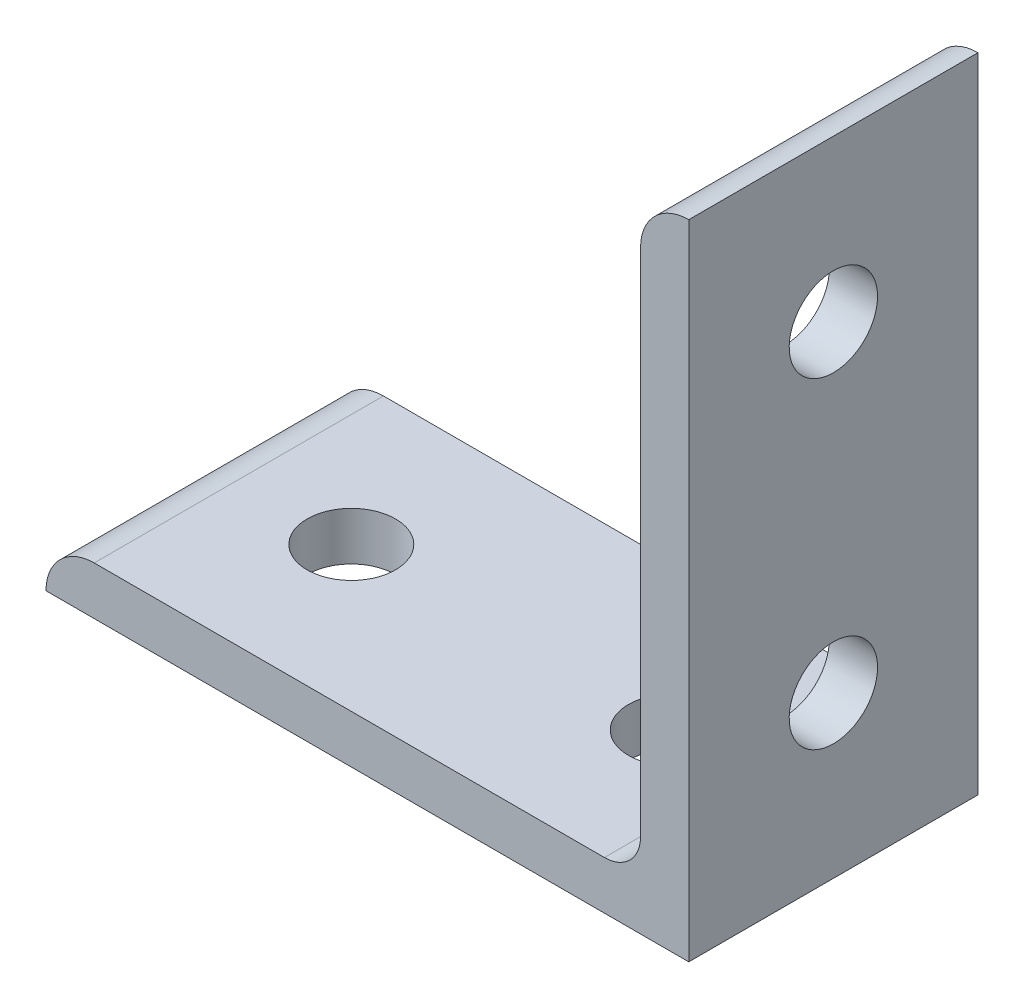
ISO-10303-21;
HEADER;
FILE_DESCRIPTION(('STEP AP214'),'2;1');
FILE_NAME('part.step','',(''),(''),'','','');
FILE_SCHEMA(('AUTOMOTIVE_DESIGN { 1 0 10303 214 1 1 1 1 }'));
ENDSEC;
DATA;
#1=APPLICATION_CONTEXT('core data for automotive mechanical design processes');
#2=APPLICATION_PROTOCOL_DEFINITION('international standard','automotive_design',2000,#1);
#3=PRODUCT_CONTEXT('',#1,'mechanical');
#4=PRODUCT('Part','Part','',(#3));
#5=PRODUCT_RELATED_PRODUCT_CATEGORY('part','',(#4));
#6=PRODUCT_DEFINITION_FORMATION('','',#4);
#7=PRODUCT_DEFINITION_CONTEXT('part definition',#1,'design');
#8=PRODUCT_DEFINITION('design','',#6,#7);
#9=PRODUCT_DEFINITION_SHAPE('','',#8);
#10=(LENGTH_UNIT() NAMED_UNIT(*) SI_UNIT(.MILLI.,.METRE.));
#11=(NAMED_UNIT(*) PLANE_ANGLE_UNIT() SI_UNIT($,.RADIAN.));
#12=(NAMED_UNIT(*) SI_UNIT($,.STERADIAN.) SOLID_ANGLE_UNIT());
#13=UNCERTAINTY_MEASURE_WITH_UNIT(LENGTH_MEASURE(1.E-05),#10,'distance_accuracy_value','');
#14=(GEOMETRIC_REPRESENTATION_CONTEXT(3) GLOBAL_UNCERTAINTY_ASSIGNED_CONTEXT((#13)) GLOBAL_UNIT_ASSIGNED_CONTEXT((#10,
#11,#12)) REPRESENTATION_CONTEXT('',''));
#15=CARTESIAN_POINT('',(0.,0.,0.));
#16=DIRECTION('',(0.,0.,1.));
#17=DIRECTION('',(1.,0.,0.));
#18=AXIS2_PLACEMENT_3D('',#15,#16,#17);
#19=CARTESIAN_POINT('',(0.,0.,-9.));
#20=DIRECTION('',(0.,-1.,0.));
#21=DIRECTION('',(1.,0.,0.));
#22=AXIS2_PLACEMENT_3D('',#19,#20,#21);
#23=PLANE('',#22);
#24=CARTESIAN_POINT('',(-30.,0.,0.));
#25=DIRECTION('',(0.,1.,0.));
#26=DIRECTION('',(-1.,0.,0.));
#27=AXIS2_PLACEMENT_3D('',#24,#25,#26);
#28=CIRCLE('',#27,2.75);
#29=CARTESIAN_POINT('',(-32.75,0.,0.));
#30=VERTEX_POINT('',#29);
#31=EDGE_CURVE('E193',#30,#30,#28,.T.);
#32=ORIENTED_EDGE('',*,*,#31,.T.);
#33=EDGE_LOOP('',(#32));
#34=FACE_BOUND('',#33,.T.);
#35=CARTESIAN_POINT('',(-10.,0.,0.));
#36=DIRECTION('',(0.,1.,0.));
#37=DIRECTION('',(-1.,0.,0.));
#38=AXIS2_PLACEMENT_3D('',#35,#36,#37);
#39=CIRCLE('',#38,2.75);
#40=CARTESIAN_POINT('',(-12.75,0.,0.));
#41=VERTEX_POINT('',#40);
#42=EDGE_CURVE('E130',#41,#41,#39,.T.);
#43=ORIENTED_EDGE('',*,*,#42,.T.);
#44=EDGE_LOOP('',(#43));
#45=FACE_BOUND('',#44,.T.);
#46=DIRECTION('',(1.,0.,0.));
#47=VECTOR('',#46,1.);
#48=CARTESIAN_POINT('',(0.,0.,9.));
#49=LINE('',#48,#47);
#50=CARTESIAN_POINT('',(-40.,0.,9.));
#51=VERTEX_POINT('',#50);
#52=CARTESIAN_POINT('',(0.,0.,9.));
#53=VERTEX_POINT('',#52);
#54=EDGE_CURVE('E126',#51,#53,#49,.T.);
#55=ORIENTED_EDGE('',*,*,#54,.F.);
#56=DIRECTION('',(0.,0.,1.));
#57=VECTOR('',#56,1.);
#58=CARTESIAN_POINT('',(-40.,0.,-9.));
#59=LINE('',#58,#57);
#60=CARTESIAN_POINT('',(-40.,0.,-9.));
#61=VERTEX_POINT('',#60);
#62=EDGE_CURVE('E11',#61,#51,#59,.T.);
#63=ORIENTED_EDGE('',*,*,#62,.F.);
#64=DIRECTION('',(1.,0.,0.));
#65=VECTOR('',#64,1.);
#66=CARTESIAN_POINT('',(0.,0.,-9.));
#67=LINE('',#66,#65);
#68=CARTESIAN_POINT('',(0.,0.,-9.));
#69=VERTEX_POINT('',#68);
#70=EDGE_CURVE('E144',#61,#69,#67,.T.);
#71=ORIENTED_EDGE('',*,*,#70,.T.);
#72=DIRECTION('',(0.,0.,1.));
#73=VECTOR('',#72,1.);
#74=CARTESIAN_POINT('',(0.,0.,-9.));
#75=LINE('',#74,#73);
#76=EDGE_CURVE('E38',#69,#53,#75,.T.);
#77=ORIENTED_EDGE('',*,*,#76,.T.);
#78=EDGE_LOOP('',(#55,#63,#71,#77));
#79=FACE_BOUND('',#78,.T.);
#80=ADVANCED_FACE('F35',(#34,#45,#79),#23,.T.);
#81=CARTESIAN_POINT('',(-37.,0.,-9.));
#82=DIRECTION('',(0.,0.,1.));
#83=DIRECTION('',(1.,0.,0.));
#84=AXIS2_PLACEMENT_3D('',#81,#82,#83);
#85=CYLINDRICAL_SURFACE('',#84,2.99999999999999);
#86=CARTESIAN_POINT('',(-37.,0.,9.));
#87=DIRECTION('',(0.,0.,1.));
#88=DIRECTION('',(-1.,0.,0.));
#89=AXIS2_PLACEMENT_3D('',#86,#87,#88);
#90=CIRCLE('',#89,2.99999999999999);
#91=CARTESIAN_POINT('',(-37.,3.,9.));
#92=VERTEX_POINT('',#91);
#93=EDGE_CURVE('E142',#92,#51,#90,.T.);
#94=ORIENTED_EDGE('',*,*,#93,.F.);
#95=DIRECTION('',(0.,0.,1.));
#96=VECTOR('',#95,1.);
#97=CARTESIAN_POINT('',(-37.,3.,-9.));
#98=LINE('',#97,#96);
#99=CARTESIAN_POINT('',(-37.,3.,-9.));
#100=VERTEX_POINT('',#99);
#101=EDGE_CURVE('E44',#100,#92,#98,.T.);
#102=ORIENTED_EDGE('',*,*,#101,.F.);
#103=CARTESIAN_POINT('',(-37.,0.,-9.));
#104=DIRECTION('',(0.,0.,1.));
#105=DIRECTION('',(-1.,0.,0.));
#106=AXIS2_PLACEMENT_3D('',#103,#104,#105);
#107=CIRCLE('',#106,2.99999999999999);
#108=EDGE_CURVE('E116',#100,#61,#107,.T.);
#109=ORIENTED_EDGE('',*,*,#108,.T.);
#110=ORIENTED_EDGE('',*,*,#62,.T.);
#111=EDGE_LOOP('',(#94,#102,#109,#110));
#112=FACE_BOUND('',#111,.T.);
#113=ADVANCED_FACE('F154',(#112),#85,.T.);
#114=CARTESIAN_POINT('',(-37.,3.,-9.));
#115=DIRECTION('',(0.,1.,0.));
#116=DIRECTION('',(-1.,0.,0.));
#117=AXIS2_PLACEMENT_3D('',#114,#115,#116);
#118=PLANE('',#117);
#119=CARTESIAN_POINT('',(-30.,3.,0.));
#120=DIRECTION('',(0.,1.,0.));
#121=DIRECTION('',(-1.,0.,0.));
#122=AXIS2_PLACEMENT_3D('',#119,#120,#121);
#123=CIRCLE('',#122,2.75);
#124=CARTESIAN_POINT('',(-32.75,3.,0.));
#125=VERTEX_POINT('',#124);
#126=EDGE_CURVE('E189',#125,#125,#123,.T.);
#127=ORIENTED_EDGE('',*,*,#126,.F.);
#128=EDGE_LOOP('',(#127));
#129=FACE_BOUND('',#128,.T.);
#130=CARTESIAN_POINT('',(-10.,3.,0.));
#131=DIRECTION('',(0.,1.,0.));
#132=DIRECTION('',(-1.,0.,0.));
#133=AXIS2_PLACEMENT_3D('',#130,#131,#132);
#134=CIRCLE('',#133,2.75);
#135=CARTESIAN_POINT('',(-12.75,3.,0.));
#136=VERTEX_POINT('',#135);
#137=EDGE_CURVE('E202',#136,#136,#134,.T.);
#138=ORIENTED_EDGE('',*,*,#137,.F.);
#139=EDGE_LOOP('',(#138));
#140=FACE_BOUND('',#139,.T.);
#141=DIRECTION('',(-1.,0.,0.));
#142=VECTOR('',#141,1.);
#143=CARTESIAN_POINT('',(-37.,3.,9.));
#144=LINE('',#143,#142);
#145=CARTESIAN_POINT('',(-5.25,3.,9.));
#146=VERTEX_POINT('',#145);
#147=EDGE_CURVE('E103',#146,#92,#144,.T.);
#148=ORIENTED_EDGE('',*,*,#147,.F.);
#149=DIRECTION('',(0.,0.,1.));
#150=VECTOR('',#149,1.);
#151=CARTESIAN_POINT('',(-5.25,3.,-9.));
#152=LINE('',#151,#150);
#153=CARTESIAN_POINT('',(-5.25,3.,-9.));
#154=VERTEX_POINT('',#153);
#155=EDGE_CURVE('E98',#154,#146,#152,.T.);
#156=ORIENTED_EDGE('',*,*,#155,.F.);
#157=DIRECTION('',(-1.,0.,0.));
#158=VECTOR('',#157,1.);
#159=CARTESIAN_POINT('',(-37.,3.,-9.));
#160=LINE('',#159,#158);
#161=EDGE_CURVE('E101',#154,#100,#160,.T.);
#162=ORIENTED_EDGE('',*,*,#161,.T.);
#163=ORIENTED_EDGE('',*,*,#101,.T.);
#164=EDGE_LOOP('',(#148,#156,#162,#163));
#165=FACE_BOUND('',#164,.T.);
#166=ADVANCED_FACE('F100',(#129,#140,#165),#118,.T.);
#167=CARTESIAN_POINT('',(-5.25,5.25,-9.));
#168=DIRECTION('',(0.,0.,1.));
#169=DIRECTION('',(1.,0.,0.));
#170=AXIS2_PLACEMENT_3D('',#167,#168,#169);
#171=CYLINDRICAL_SURFACE('',#170,2.25);
#172=CARTESIAN_POINT('',(-5.25,5.25,9.));
#173=DIRECTION('',(0.,0.,-1.));
#174=DIRECTION('',(1.,0.,0.));
#175=AXIS2_PLACEMENT_3D('',#172,#173,#174);
#176=CIRCLE('',#175,2.25);
#177=CARTESIAN_POINT('',(-3.,5.25,9.));
#178=VERTEX_POINT('',#177);
#179=EDGE_CURVE('E139',#178,#146,#176,.T.);
#180=ORIENTED_EDGE('',*,*,#179,.F.);
#181=DIRECTION('',(0.,0.,1.));
#182=VECTOR('',#181,1.);
#183=CARTESIAN_POINT('',(-3.,5.25,-9.));
#184=LINE('',#183,#182);
#185=CARTESIAN_POINT('',(-3.,5.25,-9.));
#186=VERTEX_POINT('',#185);
#187=EDGE_CURVE('E108',#186,#178,#184,.T.);
#188=ORIENTED_EDGE('',*,*,#187,.F.);
#189=CARTESIAN_POINT('',(-5.25,5.25,-9.));
#190=DIRECTION('',(0.,0.,-1.));
#191=DIRECTION('',(1.,0.,0.));
#192=AXIS2_PLACEMENT_3D('',#189,#190,#191);
#193=CIRCLE('',#192,2.25);
#194=EDGE_CURVE('E114',#186,#154,#193,.T.);
#195=ORIENTED_EDGE('',*,*,#194,.T.);
#196=ORIENTED_EDGE('',*,*,#155,.T.);
#197=EDGE_LOOP('',(#180,#188,#195,#196));
#198=FACE_BOUND('',#197,.T.);
#199=ADVANCED_FACE('F118',(#198),#171,.F.);
#200=CARTESIAN_POINT('',(-3.,5.25,-9.));
#201=DIRECTION('',(-1.,0.,0.));
#202=DIRECTION('',(0.,-1.,0.));
#203=AXIS2_PLACEMENT_3D('',#200,#201,#202);
#204=PLANE('',#203);
#205=CARTESIAN_POINT('',(-3.,10.,0.));
#206=DIRECTION('',(-1.,0.,0.));
#207=DIRECTION('',(0.,-1.,0.));
#208=AXIS2_PLACEMENT_3D('',#205,#206,#207);
#209=CIRCLE('',#208,2.75);
#210=CARTESIAN_POINT('',(-3.,7.25,0.));
#211=VERTEX_POINT('',#210);
#212=EDGE_CURVE('E198',#211,#211,#209,.T.);
#213=ORIENTED_EDGE('',*,*,#212,.F.);
#214=EDGE_LOOP('',(#213));
#215=FACE_BOUND('',#214,.T.);
#216=CARTESIAN_POINT('',(-3.,30.,0.));
#217=DIRECTION('',(-1.,0.,0.));
#218=DIRECTION('',(0.,-1.,0.));
#219=AXIS2_PLACEMENT_3D('',#216,#217,#218);
#220=CIRCLE('',#219,2.75);
#221=CARTESIAN_POINT('',(-3.,27.25,0.));
#222=VERTEX_POINT('',#221);
#223=EDGE_CURVE('E190',#222,#222,#220,.T.);
#224=ORIENTED_EDGE('',*,*,#223,.F.);
#225=EDGE_LOOP('',(#224));
#226=FACE_BOUND('',#225,.T.);
#227=DIRECTION('',(0.,-1.,0.));
#228=VECTOR('',#227,1.);
#229=CARTESIAN_POINT('',(-3.,5.25,9.));
#230=LINE('',#229,#228);
#231=CARTESIAN_POINT('',(-2.99999999999999,37.,9.));
#232=VERTEX_POINT('',#231);
#233=EDGE_CURVE('E136',#232,#178,#230,.T.);
#234=ORIENTED_EDGE('',*,*,#233,.F.);
#235=DIRECTION('',(0.,0.,1.));
#236=VECTOR('',#235,1.);
#237=CARTESIAN_POINT('',(-2.99999999999999,37.,-9.));
#238=LINE('',#237,#236);
#239=CARTESIAN_POINT('',(-2.99999999999999,37.,-9.));
#240=VERTEX_POINT('',#239);
#241=EDGE_CURVE('E148',#240,#232,#238,.T.);
#242=ORIENTED_EDGE('',*,*,#241,.F.);
#243=DIRECTION('',(0.,-1.,0.));
#244=VECTOR('',#243,1.);
#245=CARTESIAN_POINT('',(-3.,5.25,-9.));
#246=LINE('',#245,#244);
#247=EDGE_CURVE('E119',#240,#186,#246,.T.);
#248=ORIENTED_EDGE('',*,*,#247,.T.);
#249=ORIENTED_EDGE('',*,*,#187,.T.);
#250=EDGE_LOOP('',(#234,#242,#248,#249));
#251=FACE_BOUND('',#250,.T.);
#252=ADVANCED_FACE('F169',(#215,#226,#251),#204,.T.);
#253=CARTESIAN_POINT('',(0.,37.,-9.));
#254=DIRECTION('',(0.,0.,1.));
#255=DIRECTION('',(1.,0.,0.));
#256=AXIS2_PLACEMENT_3D('',#253,#254,#255);
#257=CYLINDRICAL_SURFACE('',#256,2.99999999999999);
#258=CARTESIAN_POINT('',(0.,37.,9.));
#259=DIRECTION('',(0.,0.,1.));
#260=DIRECTION('',(-1.,0.,0.));
#261=AXIS2_PLACEMENT_3D('',#258,#259,#260);
#262=CIRCLE('',#261,2.99999999999999);
#263=CARTESIAN_POINT('',(0.,40.,9.));
#264=VERTEX_POINT('',#263);
#265=EDGE_CURVE('E133',#264,#232,#262,.T.);
#266=ORIENTED_EDGE('',*,*,#265,.F.);
#267=DIRECTION('',(0.,0.,1.));
#268=VECTOR('',#267,1.);
#269=CARTESIAN_POINT('',(0.,40.,-9.));
#270=LINE('',#269,#268);
#271=CARTESIAN_POINT('',(0.,40.,-9.));
#272=VERTEX_POINT('',#271);
#273=EDGE_CURVE('E149',#272,#264,#270,.T.);
#274=ORIENTED_EDGE('',*,*,#273,.F.);
#275=CARTESIAN_POINT('',(0.,37.,-9.));
#276=DIRECTION('',(0.,0.,1.));
#277=DIRECTION('',(-1.,0.,0.));
#278=AXIS2_PLACEMENT_3D('',#275,#276,#277);
#279=CIRCLE('',#278,2.99999999999999);
#280=EDGE_CURVE('E121',#272,#240,#279,.T.);
#281=ORIENTED_EDGE('',*,*,#280,.T.);
#282=ORIENTED_EDGE('',*,*,#241,.T.);
#283=EDGE_LOOP('',(#266,#274,#281,#282));
#284=FACE_BOUND('',#283,.T.);
#285=ADVANCED_FACE('F172',(#284),#257,.T.);
#286=CARTESIAN_POINT('',(0.,0.,-9.));
#287=DIRECTION('',(1.,0.,0.));
#288=DIRECTION('',(0.,0.,-1.));
#289=AXIS2_PLACEMENT_3D('',#286,#287,#288);
#290=PLANE('',#289);
#291=CARTESIAN_POINT('',(0.,10.,0.));
#292=DIRECTION('',(-1.,0.,0.));
#293=DIRECTION('',(0.,-1.,0.));
#294=AXIS2_PLACEMENT_3D('',#291,#292,#293);
#295=CIRCLE('',#294,2.75);
#296=CARTESIAN_POINT('',(0.,7.25,0.));
#297=VERTEX_POINT('',#296);
#298=EDGE_CURVE('E184',#297,#297,#295,.T.);
#299=ORIENTED_EDGE('',*,*,#298,.T.);
#300=EDGE_LOOP('',(#299));
#301=FACE_BOUND('',#300,.T.);
#302=CARTESIAN_POINT('',(0.,30.,0.));
#303=DIRECTION('',(-1.,0.,0.));
#304=DIRECTION('',(0.,-1.,0.));
#305=AXIS2_PLACEMENT_3D('',#302,#303,#304);
#306=CIRCLE('',#305,2.75);
#307=CARTESIAN_POINT('',(0.,27.25,0.));
#308=VERTEX_POINT('',#307);
#309=EDGE_CURVE('E187',#308,#308,#306,.T.);
#310=ORIENTED_EDGE('',*,*,#309,.T.);
#311=EDGE_LOOP('',(#310));
#312=FACE_BOUND('',#311,.T.);
#313=DIRECTION('',(0.,1.,0.));
#314=VECTOR('',#313,1.);
#315=CARTESIAN_POINT('',(0.,0.,9.));
#316=LINE('',#315,#314);
#317=EDGE_CURVE('E129',#53,#264,#316,.T.);
#318=ORIENTED_EDGE('',*,*,#317,.F.);
#319=ORIENTED_EDGE('',*,*,#76,.F.);
#320=DIRECTION('',(0.,1.,0.));
#321=VECTOR('',#320,1.);
#322=CARTESIAN_POINT('',(0.,0.,-9.));
#323=LINE('',#322,#321);
#324=EDGE_CURVE('E209',#69,#272,#323,.T.);
#325=ORIENTED_EDGE('',*,*,#324,.T.);
#326=ORIENTED_EDGE('',*,*,#273,.T.);
#327=EDGE_LOOP('',(#318,#319,#325,#326));
#328=FACE_BOUND('',#327,.T.);
#329=ADVANCED_FACE('F151',(#301,#312,#328),#290,.T.);
#330=CARTESIAN_POINT('',(-37.,0.,-9.));
#331=DIRECTION('',(0.,0.,-1.));
#332=DIRECTION('',(-1.,0.,0.));
#333=AXIS2_PLACEMENT_3D('',#330,#331,#332);
#334=PLANE('',#333);
#335=ORIENTED_EDGE('',*,*,#70,.F.);
#336=ORIENTED_EDGE('',*,*,#108,.F.);
#337=ORIENTED_EDGE('',*,*,#161,.F.);
#338=ORIENTED_EDGE('',*,*,#194,.F.);
#339=ORIENTED_EDGE('',*,*,#247,.F.);
#340=ORIENTED_EDGE('',*,*,#280,.F.);
#341=ORIENTED_EDGE('',*,*,#324,.F.);
#342=EDGE_LOOP('',(#335,#336,#337,#338,#339,#340,#341));
#343=FACE_BOUND('',#342,.T.);
#344=ADVANCED_FACE('F112',(#343),#334,.T.);
#345=CARTESIAN_POINT('',(-37.,0.,9.));
#346=DIRECTION('',(0.,0.,-1.));
#347=DIRECTION('',(-1.,0.,0.));
#348=AXIS2_PLACEMENT_3D('',#345,#346,#347);
#349=PLANE('',#348);
#350=ORIENTED_EDGE('',*,*,#54,.T.);
#351=ORIENTED_EDGE('',*,*,#317,.T.);
#352=ORIENTED_EDGE('',*,*,#265,.T.);
#353=ORIENTED_EDGE('',*,*,#233,.T.);
#354=ORIENTED_EDGE('',*,*,#179,.T.);
#355=ORIENTED_EDGE('',*,*,#147,.T.);
#356=ORIENTED_EDGE('',*,*,#93,.T.);
#357=EDGE_LOOP('',(#350,#351,#352,#353,#354,#355,#356));
#358=FACE_BOUND('',#357,.T.);
#359=ADVANCED_FACE('F153',(#358),#349,.F.);
#360=CARTESIAN_POINT('',(-10.,0.,0.));
#361=DIRECTION('',(0.,1.,0.));
#362=DIRECTION('',(-1.,0.,0.));
#363=AXIS2_PLACEMENT_3D('',#360,#361,#362);
#364=CYLINDRICAL_SURFACE('',#363,2.75);
#365=ORIENTED_EDGE('',*,*,#42,.F.);
#366=EDGE_LOOP('',(#365));
#367=FACE_BOUND('',#366,.T.);
#368=ORIENTED_EDGE('',*,*,#137,.T.);
#369=EDGE_LOOP('',(#368));
#370=FACE_BOUND('',#369,.T.);
#371=ADVANCED_FACE('F216',(#367,#370),#364,.F.);
#372=CARTESIAN_POINT('',(-30.,0.,0.));
#373=DIRECTION('',(0.,1.,0.));
#374=DIRECTION('',(-1.,0.,0.));
#375=AXIS2_PLACEMENT_3D('',#372,#373,#374);
#376=CYLINDRICAL_SURFACE('',#375,2.75);
#377=ORIENTED_EDGE('',*,*,#31,.F.);
#378=EDGE_LOOP('',(#377));
#379=FACE_BOUND('',#378,.T.);
#380=ORIENTED_EDGE('',*,*,#126,.T.);
#381=EDGE_LOOP('',(#380));
#382=FACE_BOUND('',#381,.T.);
#383=ADVANCED_FACE('F219',(#379,#382),#376,.F.);
#384=CARTESIAN_POINT('',(0.,30.,0.));
#385=DIRECTION('',(-1.,0.,0.));
#386=DIRECTION('',(0.,-1.,0.));
#387=AXIS2_PLACEMENT_3D('',#384,#385,#386);
#388=CYLINDRICAL_SURFACE('',#387,2.75);
#389=ORIENTED_EDGE('',*,*,#309,.F.);
#390=EDGE_LOOP('',(#389));
#391=FACE_BOUND('',#390,.T.);
#392=ORIENTED_EDGE('',*,*,#223,.T.);
#393=EDGE_LOOP('',(#392));
#394=FACE_BOUND('',#393,.T.);
#395=ADVANCED_FACE('F226',(#391,#394),#388,.F.);
#396=CARTESIAN_POINT('',(0.,10.,0.));
#397=DIRECTION('',(-1.,0.,0.));
#398=DIRECTION('',(0.,-1.,0.));
#399=AXIS2_PLACEMENT_3D('',#396,#397,#398);
#400=CYLINDRICAL_SURFACE('',#399,2.75);
#401=ORIENTED_EDGE('',*,*,#298,.F.);
#402=EDGE_LOOP('',(#401));
#403=FACE_BOUND('',#402,.T.);
#404=ORIENTED_EDGE('',*,*,#212,.T.);
#405=EDGE_LOOP('',(#404));
#406=FACE_BOUND('',#405,.T.);
#407=ADVANCED_FACE('F233',(#403,#406),#400,.F.);
#408=CLOSED_SHELL('',(#80,#113,#166,#199,#252,#285,#329,#344,#359,#371,#383,#395,#407));
#409=MANIFOLD_SOLID_BREP('B2',#408);
#410=ADVANCED_BREP_SHAPE_REPRESENTATION('',(#18,#409),#14);
#411=SHAPE_DEFINITION_REPRESENTATION(#9,#410);
ENDSEC;
END-ISO-10303-21;
